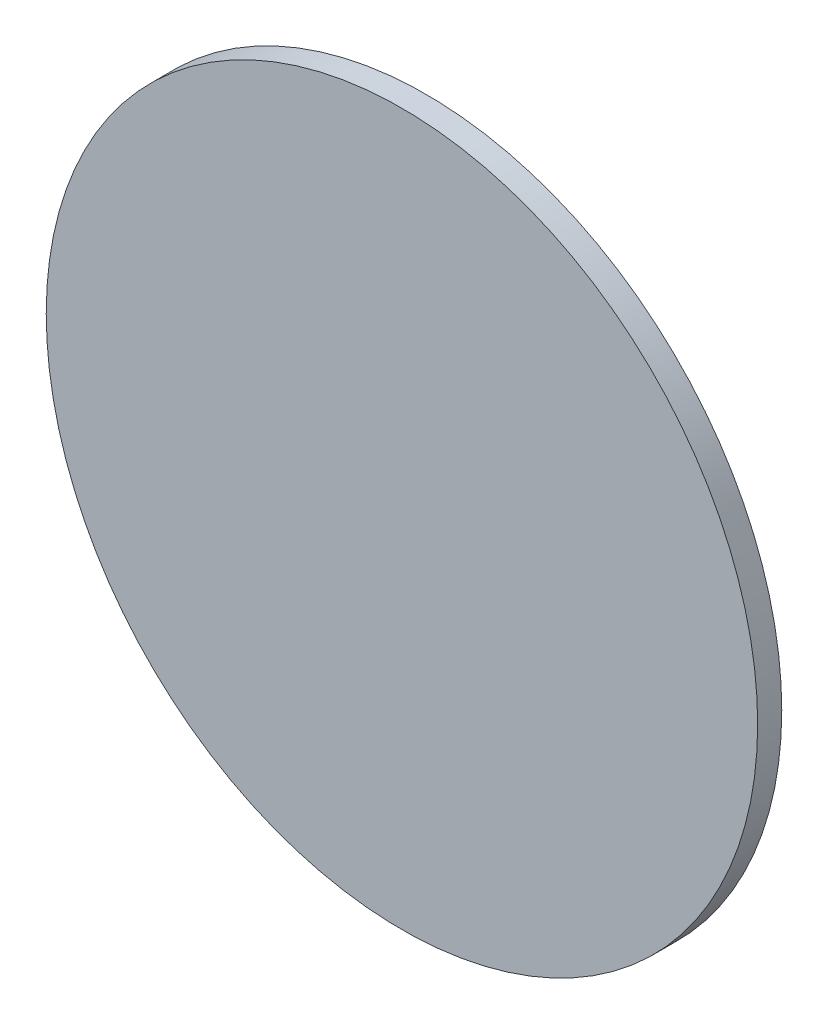
ISO-10303-21;
HEADER;
FILE_DESCRIPTION(('STEP AP214'),'2;1');
FILE_NAME('part.step','',(''),(''),'','','');
FILE_SCHEMA(('AUTOMOTIVE_DESIGN { 1 0 10303 214 1 1 1 1 }'));
ENDSEC;
DATA;
#1=APPLICATION_CONTEXT('core data for automotive mechanical design processes');
#2=APPLICATION_PROTOCOL_DEFINITION('international standard','automotive_design',2000,#1);
#3=PRODUCT_CONTEXT('',#1,'mechanical');
#4=PRODUCT('Part','Part','',(#3));
#5=PRODUCT_RELATED_PRODUCT_CATEGORY('part','',(#4));
#6=PRODUCT_DEFINITION_FORMATION('','',#4);
#7=PRODUCT_DEFINITION_CONTEXT('part definition',#1,'design');
#8=PRODUCT_DEFINITION('design','',#6,#7);
#9=PRODUCT_DEFINITION_SHAPE('','',#8);
#10=(LENGTH_UNIT() NAMED_UNIT(*) SI_UNIT(.MILLI.,.METRE.));
#11=(NAMED_UNIT(*) PLANE_ANGLE_UNIT() SI_UNIT($,.RADIAN.));
#12=(NAMED_UNIT(*) SI_UNIT($,.STERADIAN.) SOLID_ANGLE_UNIT());
#13=UNCERTAINTY_MEASURE_WITH_UNIT(LENGTH_MEASURE(1.E-05),#10,'distance_accuracy_value','');
#14=(GEOMETRIC_REPRESENTATION_CONTEXT(3) GLOBAL_UNCERTAINTY_ASSIGNED_CONTEXT((#13)) GLOBAL_UNIT_ASSIGNED_CONTEXT((#10,
#11,#12)) REPRESENTATION_CONTEXT('',''));
#15=CARTESIAN_POINT('',(0.,0.,0.));
#16=DIRECTION('',(0.,0.,1.));
#17=DIRECTION('',(1.,0.,0.));
#18=AXIS2_PLACEMENT_3D('',#15,#16,#17);
#19=CARTESIAN_POINT('',(-3.719,5.173,11.731));
#20=DIRECTION('',(0.,0.,-1.));
#21=DIRECTION('',(-1.,0.,0.));
#22=AXIS2_PLACEMENT_3D('',#19,#20,#21);
#23=CYLINDRICAL_SURFACE('',#22,173.217);
#24=CARTESIAN_POINT('',(-3.719,5.173,11.731));
#25=DIRECTION('',(0.,0.,1.));
#26=DIRECTION('',(1.,0.,0.));
#27=AXIS2_PLACEMENT_3D('',#24,#25,#26);
#28=CIRCLE('',#27,173.217);
#29=CARTESIAN_POINT('',(169.498,5.173,11.731));
#30=VERTEX_POINT('',#29);
#31=EDGE_CURVE('E10',#30,#30,#28,.T.);
#32=ORIENTED_EDGE('',*,*,#31,.F.);
#33=EDGE_LOOP('',(#32));
#34=FACE_BOUND('',#33,.T.);
#35=CARTESIAN_POINT('',(-3.719,5.173,0.));
#36=DIRECTION('',(0.,0.,1.));
#37=DIRECTION('',(1.,0.,0.));
#38=AXIS2_PLACEMENT_3D('',#35,#36,#37);
#39=CIRCLE('',#38,173.217);
#40=CARTESIAN_POINT('',(169.498,5.173,0.));
#41=VERTEX_POINT('',#40);
#42=EDGE_CURVE('E45',#41,#41,#39,.T.);
#43=ORIENTED_EDGE('',*,*,#42,.T.);
#44=EDGE_LOOP('',(#43));
#45=FACE_BOUND('',#44,.T.);
#46=ADVANCED_FACE('F39',(#34,#45),#23,.T.);
#47=CARTESIAN_POINT('',(-3.719,5.173,11.731));
#48=DIRECTION('',(0.,0.,1.));
#49=DIRECTION('',(1.,0.,0.));
#50=AXIS2_PLACEMENT_3D('',#47,#48,#49);
#51=PLANE('',#50);
#52=ORIENTED_EDGE('',*,*,#31,.T.);
#53=EDGE_LOOP('',(#52));
#54=FACE_BOUND('',#53,.T.);
#55=ADVANCED_FACE('F53',(#54),#51,.T.);
#56=CARTESIAN_POINT('',(-3.719,5.173,0.));
#57=DIRECTION('',(0.,0.,1.));
#58=DIRECTION('',(1.,0.,0.));
#59=AXIS2_PLACEMENT_3D('',#56,#57,#58);
#60=PLANE('',#59);
#61=ORIENTED_EDGE('',*,*,#42,.F.);
#62=EDGE_LOOP('',(#61));
#63=FACE_BOUND('',#62,.T.);
#64=ADVANCED_FACE('F55',(#63),#60,.F.);
#65=CLOSED_SHELL('',(#46,#55,#64));
#66=MANIFOLD_SOLID_BREP('B2',#65);
#67=ADVANCED_BREP_SHAPE_REPRESENTATION('',(#18,#66),#14);
#68=SHAPE_DEFINITION_REPRESENTATION(#9,#67);
ENDSEC;
END-ISO-10303-21;
